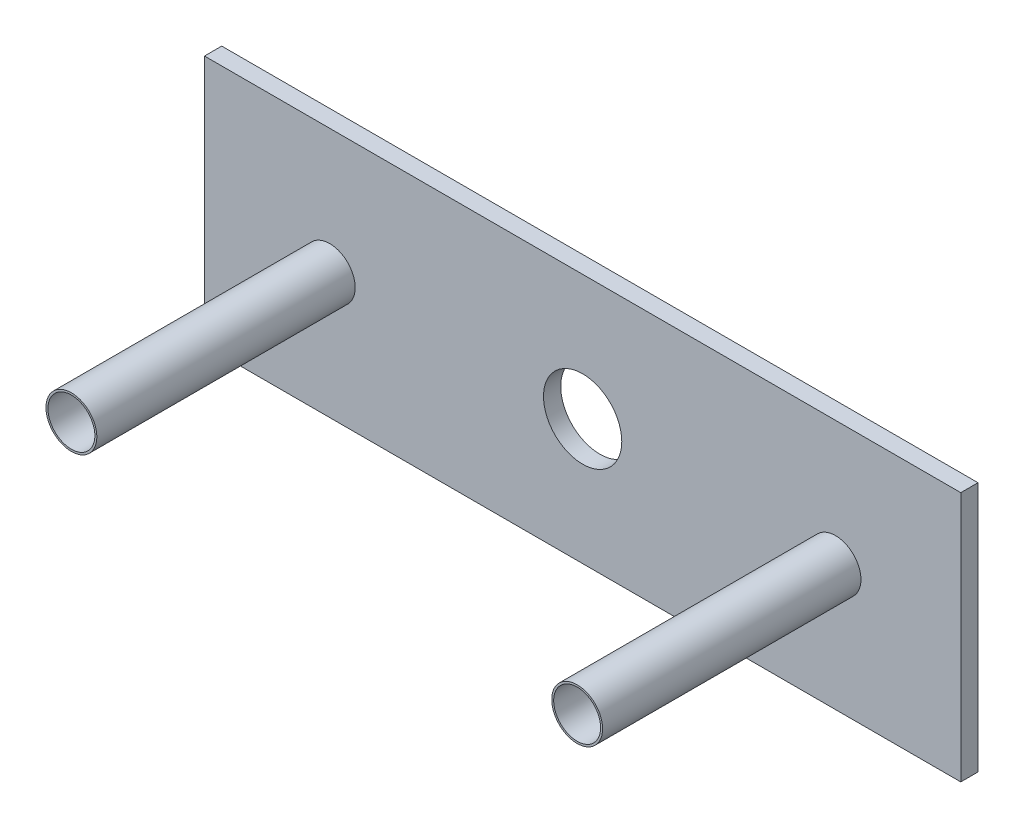
ISO-10303-21;
HEADER;
FILE_DESCRIPTION(('STEP AP214'),'2;1');
FILE_NAME('part.step','',(''),(''),'','','');
FILE_SCHEMA(('AUTOMOTIVE_DESIGN { 1 0 10303 214 1 1 1 1 }'));
ENDSEC;
DATA;
#1=APPLICATION_CONTEXT('core data for automotive mechanical design processes');
#2=APPLICATION_PROTOCOL_DEFINITION('international standard','automotive_design',2000,#1);
#3=PRODUCT_CONTEXT('',#1,'mechanical');
#4=PRODUCT('Part','Part','',(#3));
#5=PRODUCT_RELATED_PRODUCT_CATEGORY('part','',(#4));
#6=PRODUCT_DEFINITION_FORMATION('','',#4);
#7=PRODUCT_DEFINITION_CONTEXT('part definition',#1,'design');
#8=PRODUCT_DEFINITION('design','',#6,#7);
#9=PRODUCT_DEFINITION_SHAPE('','',#8);
#10=(LENGTH_UNIT() NAMED_UNIT(*) SI_UNIT(.MILLI.,.METRE.));
#11=(NAMED_UNIT(*) PLANE_ANGLE_UNIT() SI_UNIT($,.RADIAN.));
#12=(NAMED_UNIT(*) SI_UNIT($,.STERADIAN.) SOLID_ANGLE_UNIT());
#13=UNCERTAINTY_MEASURE_WITH_UNIT(LENGTH_MEASURE(1.E-05),#10,'distance_accuracy_value','');
#14=(GEOMETRIC_REPRESENTATION_CONTEXT(3) GLOBAL_UNCERTAINTY_ASSIGNED_CONTEXT((#13)) GLOBAL_UNIT_ASSIGNED_CONTEXT((#10,
#11,#12)) REPRESENTATION_CONTEXT('',''));
#15=CARTESIAN_POINT('',(0.,0.,0.));
#16=DIRECTION('',(0.,0.,1.));
#17=DIRECTION('',(1.,0.,0.));
#18=AXIS2_PLACEMENT_3D('',#15,#16,#17);
#19=CARTESIAN_POINT('',(-47.6288432611678,18.259938231017,2.2));
#20=DIRECTION('',(1.,0.,0.));
#21=DIRECTION('',(0.,0.,-1.));
#22=AXIS2_PLACEMENT_3D('',#19,#20,#21);
#23=PLANE('',#22);
#24=DIRECTION('',(0.,-1.,0.));
#25=VECTOR('',#24,1.);
#26=CARTESIAN_POINT('',(-47.6288432611678,18.259938231017,0.));
#27=LINE('',#26,#25);
#28=CARTESIAN_POINT('',(-47.6288432611678,18.259938231017,0.));
#29=VERTEX_POINT('',#28);
#30=CARTESIAN_POINT('',(-47.6288432611678,-13.740061768983,0.));
#31=VERTEX_POINT('',#30);
#32=EDGE_CURVE('E107',#29,#31,#27,.T.);
#33=ORIENTED_EDGE('',*,*,#32,.T.);
#34=DIRECTION('',(0.,0.,-1.));
#35=VECTOR('',#34,1.);
#36=CARTESIAN_POINT('',(-47.6288432611678,-13.740061768983,2.2));
#37=LINE('',#36,#35);
#38=CARTESIAN_POINT('',(-47.6288432611678,-13.740061768983,2.2));
#39=VERTEX_POINT('',#38);
#40=EDGE_CURVE('E11',#39,#31,#37,.T.);
#41=ORIENTED_EDGE('',*,*,#40,.F.);
#42=DIRECTION('',(0.,-1.,0.));
#43=VECTOR('',#42,1.);
#44=CARTESIAN_POINT('',(-47.6288432611678,18.259938231017,2.2));
#45=LINE('',#44,#43);
#46=CARTESIAN_POINT('',(-47.6288432611678,18.259938231017,2.2));
#47=VERTEX_POINT('',#46);
#48=EDGE_CURVE('E91',#47,#39,#45,.T.);
#49=ORIENTED_EDGE('',*,*,#48,.F.);
#50=DIRECTION('',(0.,0.,-1.));
#51=VECTOR('',#50,1.);
#52=CARTESIAN_POINT('',(-47.6288432611678,18.259938231017,2.2));
#53=LINE('',#52,#51);
#54=EDGE_CURVE('E103',#47,#29,#53,.T.);
#55=ORIENTED_EDGE('',*,*,#54,.T.);
#56=EDGE_LOOP('',(#33,#41,#49,#55));
#57=FACE_BOUND('',#56,.T.);
#58=ADVANCED_FACE('F39',(#57),#23,.F.);
#59=CARTESIAN_POINT('',(-47.6288432611678,-13.740061768983,2.2));
#60=DIRECTION('',(0.,1.,0.));
#61=DIRECTION('',(0.,0.,1.));
#62=AXIS2_PLACEMENT_3D('',#59,#60,#61);
#63=PLANE('',#62);
#64=DIRECTION('',(1.,0.,0.));
#65=VECTOR('',#64,1.);
#66=CARTESIAN_POINT('',(-47.6288432611678,-13.740061768983,0.));
#67=LINE('',#66,#65);
#68=CARTESIAN_POINT('',(48.9711567388322,-13.740061768983,0.));
#69=VERTEX_POINT('',#68);
#70=EDGE_CURVE('E96',#31,#69,#67,.T.);
#71=ORIENTED_EDGE('',*,*,#70,.T.);
#72=DIRECTION('',(0.,0.,-1.));
#73=VECTOR('',#72,1.);
#74=CARTESIAN_POINT('',(48.9711567388322,-13.740061768983,2.2));
#75=LINE('',#74,#73);
#76=CARTESIAN_POINT('',(48.9711567388322,-13.740061768983,2.2));
#77=VERTEX_POINT('',#76);
#78=EDGE_CURVE('E48',#77,#69,#75,.T.);
#79=ORIENTED_EDGE('',*,*,#78,.F.);
#80=DIRECTION('',(1.,0.,0.));
#81=VECTOR('',#80,1.);
#82=CARTESIAN_POINT('',(-47.6288432611678,-13.740061768983,2.2));
#83=LINE('',#82,#81);
#84=EDGE_CURVE('E86',#39,#77,#83,.T.);
#85=ORIENTED_EDGE('',*,*,#84,.F.);
#86=ORIENTED_EDGE('',*,*,#40,.T.);
#87=EDGE_LOOP('',(#71,#79,#85,#86));
#88=FACE_BOUND('',#87,.T.);
#89=ADVANCED_FACE('F95',(#88),#63,.F.);
#90=CARTESIAN_POINT('',(48.9711567388322,18.259938231017,2.2));
#91=DIRECTION('',(-1.,0.,0.));
#92=DIRECTION('',(0.,0.,1.));
#93=AXIS2_PLACEMENT_3D('',#90,#91,#92);
#94=PLANE('',#93);
#95=DIRECTION('',(0.,1.,0.));
#96=VECTOR('',#95,1.);
#97=CARTESIAN_POINT('',(48.9711567388322,18.259938231017,0.));
#98=LINE('',#97,#96);
#99=CARTESIAN_POINT('',(48.9711567388322,18.259938231017,0.));
#100=VERTEX_POINT('',#99);
#101=EDGE_CURVE('E73',#69,#100,#98,.T.);
#102=ORIENTED_EDGE('',*,*,#101,.T.);
#103=DIRECTION('',(0.,0.,-1.));
#104=VECTOR('',#103,1.);
#105=CARTESIAN_POINT('',(48.9711567388322,18.259938231017,2.2));
#106=LINE('',#105,#104);
#107=CARTESIAN_POINT('',(48.9711567388322,18.259938231017,2.2));
#108=VERTEX_POINT('',#107);
#109=EDGE_CURVE('E98',#108,#100,#106,.T.);
#110=ORIENTED_EDGE('',*,*,#109,.F.);
#111=DIRECTION('',(0.,1.,0.));
#112=VECTOR('',#111,1.);
#113=CARTESIAN_POINT('',(48.9711567388322,18.259938231017,2.2));
#114=LINE('',#113,#112);
#115=EDGE_CURVE('E89',#77,#108,#114,.T.);
#116=ORIENTED_EDGE('',*,*,#115,.F.);
#117=ORIENTED_EDGE('',*,*,#78,.T.);
#118=EDGE_LOOP('',(#102,#110,#116,#117));
#119=FACE_BOUND('',#118,.T.);
#120=ADVANCED_FACE('F99',(#119),#94,.F.);
#121=CARTESIAN_POINT('',(-47.6288432611678,18.259938231017,2.2));
#122=DIRECTION('',(0.,-1.,0.));
#123=DIRECTION('',(0.,0.,-1.));
#124=AXIS2_PLACEMENT_3D('',#121,#122,#123);
#125=PLANE('',#124);
#126=DIRECTION('',(-1.,0.,0.));
#127=VECTOR('',#126,1.);
#128=CARTESIAN_POINT('',(-47.6288432611678,18.259938231017,0.));
#129=LINE('',#128,#127);
#130=EDGE_CURVE('E79',#100,#29,#129,.T.);
#131=ORIENTED_EDGE('',*,*,#130,.T.);
#132=ORIENTED_EDGE('',*,*,#54,.F.);
#133=DIRECTION('',(-1.,0.,0.));
#134=VECTOR('',#133,1.);
#135=CARTESIAN_POINT('',(-47.6288432611678,18.259938231017,2.2));
#136=LINE('',#135,#134);
#137=EDGE_CURVE('E56',#108,#47,#136,.T.);
#138=ORIENTED_EDGE('',*,*,#137,.F.);
#139=ORIENTED_EDGE('',*,*,#109,.T.);
#140=EDGE_LOOP('',(#131,#132,#138,#139));
#141=FACE_BOUND('',#140,.T.);
#142=ADVANCED_FACE('F121',(#141),#125,.F.);
#143=CARTESIAN_POINT('',(0.,0.,2.2));
#144=DIRECTION('',(0.,0.,1.));
#145=DIRECTION('',(1.,0.,0.));
#146=AXIS2_PLACEMENT_3D('',#143,#144,#145);
#147=PLANE('',#146);
#148=CARTESIAN_POINT('',(0.671156738832203,2.25993823101696,2.2));
#149=DIRECTION('',(0.,0.,1.));
#150=DIRECTION('',(1.,0.,0.));
#151=AXIS2_PLACEMENT_3D('',#148,#149,#150);
#152=CIRCLE('',#151,5.);
#153=CARTESIAN_POINT('',(5.6711567388322,2.25993823101696,2.2));
#154=VERTEX_POINT('',#153);
#155=EDGE_CURVE('E140',#154,#154,#152,.T.);
#156=ORIENTED_EDGE('',*,*,#155,.F.);
#157=EDGE_LOOP('',(#156));
#158=FACE_BOUND('',#157,.T.);
#159=CARTESIAN_POINT('',(32.9711567388322,2.25993823101696,2.2));
#160=DIRECTION('',(0.,0.,1.));
#161=DIRECTION('',(1.,0.,0.));
#162=AXIS2_PLACEMENT_3D('',#159,#160,#161);
#163=CIRCLE('',#162,3.25);
#164=CARTESIAN_POINT('',(36.2211567388322,2.25993823101696,2.2));
#165=VERTEX_POINT('',#164);
#166=EDGE_CURVE('E136',#165,#165,#163,.T.);
#167=ORIENTED_EDGE('',*,*,#166,.F.);
#168=EDGE_LOOP('',(#167));
#169=FACE_BOUND('',#168,.T.);
#170=CARTESIAN_POINT('',(-31.6288432611678,2.25993823101696,2.2));
#171=DIRECTION('',(0.,0.,1.));
#172=DIRECTION('',(1.,0.,0.));
#173=AXIS2_PLACEMENT_3D('',#170,#171,#172);
#174=CIRCLE('',#173,3.25);
#175=CARTESIAN_POINT('',(-28.3788432611678,2.25993823101696,2.2));
#176=VERTEX_POINT('',#175);
#177=EDGE_CURVE('E128',#176,#176,#174,.T.);
#178=ORIENTED_EDGE('',*,*,#177,.F.);
#179=EDGE_LOOP('',(#178));
#180=FACE_BOUND('',#179,.T.);
#181=ORIENTED_EDGE('',*,*,#48,.T.);
#182=ORIENTED_EDGE('',*,*,#84,.T.);
#183=ORIENTED_EDGE('',*,*,#115,.T.);
#184=ORIENTED_EDGE('',*,*,#137,.T.);
#185=EDGE_LOOP('',(#181,#182,#183,#184));
#186=FACE_BOUND('',#185,.T.);
#187=ADVANCED_FACE('F87',(#158,#169,#180,#186),#147,.T.);
#188=CARTESIAN_POINT('',(0.,0.,0.));
#189=DIRECTION('',(0.,0.,1.));
#190=DIRECTION('',(1.,0.,0.));
#191=AXIS2_PLACEMENT_3D('',#188,#189,#190);
#192=PLANE('',#191);
#193=CARTESIAN_POINT('',(-31.6288432611678,2.25993823101696,0.));
#194=DIRECTION('',(0.,0.,1.));
#195=DIRECTION('',(1.,0.,0.));
#196=AXIS2_PLACEMENT_3D('',#193,#194,#195);
#197=CIRCLE('',#196,3.);
#198=CARTESIAN_POINT('',(-28.6288432611678,2.25993823101696,0.));
#199=VERTEX_POINT('',#198);
#200=EDGE_CURVE('E147',#199,#199,#197,.T.);
#201=ORIENTED_EDGE('',*,*,#200,.T.);
#202=EDGE_LOOP('',(#201));
#203=FACE_BOUND('',#202,.T.);
#204=CARTESIAN_POINT('',(32.9711567388322,2.25993823101696,0.));
#205=DIRECTION('',(0.,0.,1.));
#206=DIRECTION('',(1.,0.,0.));
#207=AXIS2_PLACEMENT_3D('',#204,#205,#206);
#208=CIRCLE('',#207,3.);
#209=CARTESIAN_POINT('',(35.9711567388322,2.25993823101696,0.));
#210=VERTEX_POINT('',#209);
#211=EDGE_CURVE('E156',#210,#210,#208,.T.);
#212=ORIENTED_EDGE('',*,*,#211,.T.);
#213=EDGE_LOOP('',(#212));
#214=FACE_BOUND('',#213,.T.);
#215=CARTESIAN_POINT('',(0.671156738832203,2.25993823101696,0.));
#216=DIRECTION('',(0.,0.,1.));
#217=DIRECTION('',(1.,0.,0.));
#218=AXIS2_PLACEMENT_3D('',#215,#216,#217);
#219=CIRCLE('',#218,5.);
#220=CARTESIAN_POINT('',(5.6711567388322,2.25993823101696,0.));
#221=VERTEX_POINT('',#220);
#222=EDGE_CURVE('E148',#221,#221,#219,.T.);
#223=ORIENTED_EDGE('',*,*,#222,.T.);
#224=EDGE_LOOP('',(#223));
#225=FACE_BOUND('',#224,.T.);
#226=ORIENTED_EDGE('',*,*,#32,.F.);
#227=ORIENTED_EDGE('',*,*,#130,.F.);
#228=ORIENTED_EDGE('',*,*,#101,.F.);
#229=ORIENTED_EDGE('',*,*,#70,.F.);
#230=EDGE_LOOP('',(#226,#227,#228,#229));
#231=FACE_BOUND('',#230,.T.);
#232=ADVANCED_FACE('F124',(#203,#214,#225,#231),#192,.F.);
#233=CARTESIAN_POINT('',(-31.6288432611678,2.25993823101696,35.2));
#234=DIRECTION('',(0.,0.,-1.));
#235=DIRECTION('',(-1.,0.,0.));
#236=AXIS2_PLACEMENT_3D('',#233,#234,#235);
#237=CYLINDRICAL_SURFACE('',#236,3.25);
#238=CARTESIAN_POINT('',(-31.6288432611678,2.25993823101696,35.2));
#239=DIRECTION('',(0.,0.,1.));
#240=DIRECTION('',(1.,0.,0.));
#241=AXIS2_PLACEMENT_3D('',#238,#239,#240);
#242=CIRCLE('',#241,3.25);
#243=CARTESIAN_POINT('',(-28.3788432611678,2.25993823101696,35.2));
#244=VERTEX_POINT('',#243);
#245=EDGE_CURVE('E111',#244,#244,#242,.T.);
#246=ORIENTED_EDGE('',*,*,#245,.F.);
#247=EDGE_LOOP('',(#246));
#248=FACE_BOUND('',#247,.T.);
#249=ORIENTED_EDGE('',*,*,#177,.T.);
#250=EDGE_LOOP('',(#249));
#251=FACE_BOUND('',#250,.T.);
#252=ADVANCED_FACE('F182',(#248,#251),#237,.T.);
#253=CARTESIAN_POINT('',(-31.6288432611678,2.25993823101696,35.2));
#254=DIRECTION('',(0.,0.,1.));
#255=DIRECTION('',(1.,0.,0.));
#256=AXIS2_PLACEMENT_3D('',#253,#254,#255);
#257=PLANE('',#256);
#258=CARTESIAN_POINT('',(-31.6288432611678,2.25993823101696,35.2));
#259=DIRECTION('',(0.,0.,1.));
#260=DIRECTION('',(1.,0.,0.));
#261=AXIS2_PLACEMENT_3D('',#258,#259,#260);
#262=CIRCLE('',#261,3.);
#263=CARTESIAN_POINT('',(-28.6288432611678,2.25993823101696,35.2));
#264=VERTEX_POINT('',#263);
#265=EDGE_CURVE('E160',#264,#264,#262,.T.);
#266=ORIENTED_EDGE('',*,*,#265,.F.);
#267=EDGE_LOOP('',(#266));
#268=FACE_BOUND('',#267,.T.);
#269=ORIENTED_EDGE('',*,*,#245,.T.);
#270=EDGE_LOOP('',(#269));
#271=FACE_BOUND('',#270,.T.);
#272=ADVANCED_FACE('F178',(#268,#271),#257,.T.);
#273=CARTESIAN_POINT('',(32.9711567388322,2.25993823101696,35.2));
#274=DIRECTION('',(0.,0.,-1.));
#275=DIRECTION('',(-1.,0.,0.));
#276=AXIS2_PLACEMENT_3D('',#273,#274,#275);
#277=CYLINDRICAL_SURFACE('',#276,3.25);
#278=CARTESIAN_POINT('',(32.9711567388322,2.25993823101696,35.2));
#279=DIRECTION('',(0.,0.,1.));
#280=DIRECTION('',(1.,0.,0.));
#281=AXIS2_PLACEMENT_3D('',#278,#279,#280);
#282=CIRCLE('',#281,3.25);
#283=CARTESIAN_POINT('',(36.2211567388322,2.25993823101696,35.2));
#284=VERTEX_POINT('',#283);
#285=EDGE_CURVE('E132',#284,#284,#282,.T.);
#286=ORIENTED_EDGE('',*,*,#285,.F.);
#287=EDGE_LOOP('',(#286));
#288=FACE_BOUND('',#287,.T.);
#289=ORIENTED_EDGE('',*,*,#166,.T.);
#290=EDGE_LOOP('',(#289));
#291=FACE_BOUND('',#290,.T.);
#292=ADVANCED_FACE('F181',(#288,#291),#277,.T.);
#293=CARTESIAN_POINT('',(32.9711567388322,2.25993823101696,35.2));
#294=DIRECTION('',(0.,0.,1.));
#295=DIRECTION('',(1.,0.,0.));
#296=AXIS2_PLACEMENT_3D('',#293,#294,#295);
#297=PLANE('',#296);
#298=CARTESIAN_POINT('',(32.9711567388322,2.25993823101696,35.2));
#299=DIRECTION('',(0.,0.,1.));
#300=DIRECTION('',(1.,0.,0.));
#301=AXIS2_PLACEMENT_3D('',#298,#299,#300);
#302=CIRCLE('',#301,3.);
#303=CARTESIAN_POINT('',(35.9711567388322,2.25993823101696,35.2));
#304=VERTEX_POINT('',#303);
#305=EDGE_CURVE('E152',#304,#304,#302,.T.);
#306=ORIENTED_EDGE('',*,*,#305,.F.);
#307=EDGE_LOOP('',(#306));
#308=FACE_BOUND('',#307,.T.);
#309=ORIENTED_EDGE('',*,*,#285,.T.);
#310=EDGE_LOOP('',(#309));
#311=FACE_BOUND('',#310,.T.);
#312=ADVANCED_FACE('F233',(#308,#311),#297,.T.);
#313=CARTESIAN_POINT('',(32.9711567388322,2.25993823101696,0.));
#314=DIRECTION('',(0.,0.,1.));
#315=DIRECTION('',(1.,0.,0.));
#316=AXIS2_PLACEMENT_3D('',#313,#314,#315);
#317=CYLINDRICAL_SURFACE('',#316,3.);
#318=ORIENTED_EDGE('',*,*,#211,.F.);
#319=EDGE_LOOP('',(#318));
#320=FACE_BOUND('',#319,.T.);
#321=ORIENTED_EDGE('',*,*,#305,.T.);
#322=EDGE_LOOP('',(#321));
#323=FACE_BOUND('',#322,.T.);
#324=ADVANCED_FACE('F174',(#320,#323),#317,.F.);
#325=CARTESIAN_POINT('',(-31.6288432611678,2.25993823101696,0.));
#326=DIRECTION('',(0.,0.,1.));
#327=DIRECTION('',(1.,0.,0.));
#328=AXIS2_PLACEMENT_3D('',#325,#326,#327);
#329=CYLINDRICAL_SURFACE('',#328,3.);
#330=ORIENTED_EDGE('',*,*,#200,.F.);
#331=EDGE_LOOP('',(#330));
#332=FACE_BOUND('',#331,.T.);
#333=ORIENTED_EDGE('',*,*,#265,.T.);
#334=EDGE_LOOP('',(#333));
#335=FACE_BOUND('',#334,.T.);
#336=ADVANCED_FACE('F170',(#332,#335),#329,.F.);
#337=CARTESIAN_POINT('',(0.671156738832203,2.25993823101696,0.));
#338=DIRECTION('',(0.,0.,1.));
#339=DIRECTION('',(1.,0.,0.));
#340=AXIS2_PLACEMENT_3D('',#337,#338,#339);
#341=CYLINDRICAL_SURFACE('',#340,5.);
#342=ORIENTED_EDGE('',*,*,#155,.T.);
#343=EDGE_LOOP('',(#342));
#344=FACE_BOUND('',#343,.T.);
#345=ORIENTED_EDGE('',*,*,#222,.F.);
#346=EDGE_LOOP('',(#345));
#347=FACE_BOUND('',#346,.T.);
#348=ADVANCED_FACE('F173',(#344,#347),#341,.F.);
#349=CLOSED_SHELL('',(#58,#89,#120,#142,#187,#232,#252,#272,#292,#312,#324,#336,#348));
#350=MANIFOLD_SOLID_BREP('B2',#349);
#351=ADVANCED_BREP_SHAPE_REPRESENTATION('',(#18,#350),#14);
#352=SHAPE_DEFINITION_REPRESENTATION(#9,#351);
ENDSEC;
END-ISO-10303-21;
